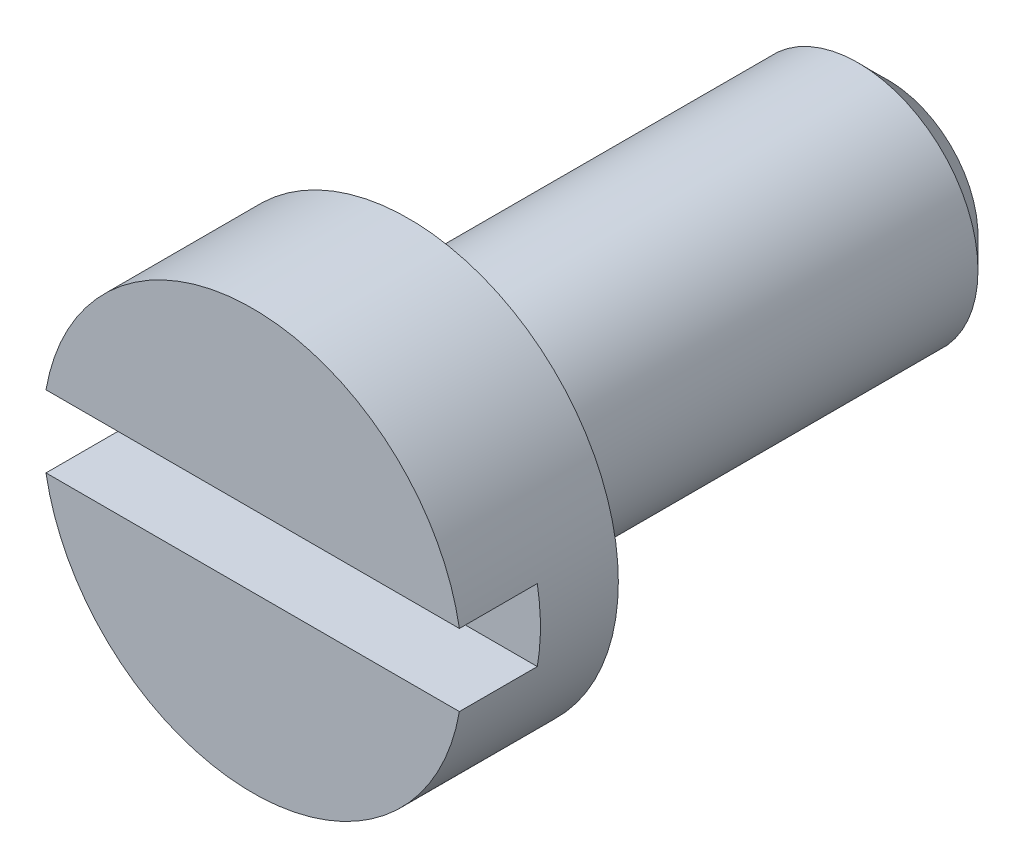
ISO-10303-21;
HEADER;
FILE_DESCRIPTION(('STEP AP214'),'2;1');
FILE_NAME('part.step','',(''),(''),'','','');
FILE_SCHEMA(('AUTOMOTIVE_DESIGN { 1 0 10303 214 1 1 1 1 }'));
ENDSEC;
DATA;
#1=APPLICATION_CONTEXT('core data for automotive mechanical design processes');
#2=APPLICATION_PROTOCOL_DEFINITION('international standard','automotive_design',2000,#1);
#3=PRODUCT_CONTEXT('',#1,'mechanical');
#4=PRODUCT('Part','Part','',(#3));
#5=PRODUCT_RELATED_PRODUCT_CATEGORY('part','',(#4));
#6=PRODUCT_DEFINITION_FORMATION('','',#4);
#7=PRODUCT_DEFINITION_CONTEXT('part definition',#1,'design');
#8=PRODUCT_DEFINITION('design','',#6,#7);
#9=PRODUCT_DEFINITION_SHAPE('','',#8);
#10=(LENGTH_UNIT() NAMED_UNIT(*) SI_UNIT(.MILLI.,.METRE.));
#11=(NAMED_UNIT(*) PLANE_ANGLE_UNIT() SI_UNIT($,.RADIAN.));
#12=(NAMED_UNIT(*) SI_UNIT($,.STERADIAN.) SOLID_ANGLE_UNIT());
#13=UNCERTAINTY_MEASURE_WITH_UNIT(LENGTH_MEASURE(1.E-05),#10,'distance_accuracy_value','');
#14=(GEOMETRIC_REPRESENTATION_CONTEXT(3) GLOBAL_UNCERTAINTY_ASSIGNED_CONTEXT((#13)) GLOBAL_UNIT_ASSIGNED_CONTEXT((#10,
#11,#12)) REPRESENTATION_CONTEXT('',''));
#15=CARTESIAN_POINT('',(0.,0.,0.));
#16=DIRECTION('',(0.,0.,1.));
#17=DIRECTION('',(1.,0.,0.));
#18=AXIS2_PLACEMENT_3D('',#15,#16,#17);
#19=CARTESIAN_POINT('',(0.,0.,2.6));
#20=DIRECTION('',(0.,0.,1.));
#21=DIRECTION('',(1.,0.,0.));
#22=AXIS2_PLACEMENT_3D('',#19,#20,#21);
#23=PLANE('',#22);
#24=DIRECTION('',(1.,0.,0.));
#25=VECTOR('',#24,1.);
#26=CARTESIAN_POINT('',(0.,-0.6,2.6));
#27=LINE('',#26,#25);
#28=CARTESIAN_POINT('',(-3.44818792991333,-0.6,2.6));
#29=VERTEX_POINT('',#28);
#30=CARTESIAN_POINT('',(3.44818792991333,-0.6,2.6));
#31=VERTEX_POINT('',#30);
#32=EDGE_CURVE('E59',#29,#31,#27,.T.);
#33=ORIENTED_EDGE('',*,*,#32,.F.);
#34=CARTESIAN_POINT('',(0.,0.,2.6));
#35=DIRECTION('',(0.,0.,1.));
#36=DIRECTION('',(1.,0.,0.));
#37=AXIS2_PLACEMENT_3D('',#34,#35,#36);
#38=CIRCLE('',#37,3.5);
#39=EDGE_CURVE('E94',#29,#31,#38,.T.);
#40=ORIENTED_EDGE('',*,*,#39,.T.);
#41=EDGE_LOOP('',(#33,#40));
#42=FACE_BOUND('',#41,.T.);
#43=ADVANCED_FACE('F36',(#42),#23,.T.);
#44=CARTESIAN_POINT('',(0.,0.,0.));
#45=DIRECTION('',(0.,0.,1.));
#46=DIRECTION('',(1.,0.,0.));
#47=AXIS2_PLACEMENT_3D('',#44,#45,#46);
#48=PLANE('',#47);
#49=CARTESIAN_POINT('',(0.,0.,0.));
#50=DIRECTION('',(0.,0.,1.));
#51=DIRECTION('',(1.,0.,0.));
#52=AXIS2_PLACEMENT_3D('',#49,#50,#51);
#53=CIRCLE('',#52,3.5);
#54=CARTESIAN_POINT('',(3.5,0.,0.));
#55=VERTEX_POINT('',#54);
#56=EDGE_CURVE('E100',#55,#55,#53,.T.);
#57=ORIENTED_EDGE('',*,*,#56,.F.);
#58=EDGE_LOOP('',(#57));
#59=FACE_BOUND('',#58,.T.);
#60=CARTESIAN_POINT('',(0.,0.,0.));
#61=DIRECTION('',(0.,0.,1.));
#62=DIRECTION('',(1.,0.,0.));
#63=AXIS2_PLACEMENT_3D('',#60,#61,#62);
#64=CIRCLE('',#63,2.);
#65=CARTESIAN_POINT('',(2.,0.,0.));
#66=VERTEX_POINT('',#65);
#67=EDGE_CURVE('E93',#66,#66,#64,.F.);
#68=ORIENTED_EDGE('',*,*,#67,.F.);
#69=EDGE_LOOP('',(#68));
#70=FACE_BOUND('',#69,.T.);
#71=ADVANCED_FACE('F124',(#59,#70),#48,.F.);
#72=CARTESIAN_POINT('',(0.,0.,2.6));
#73=DIRECTION('',(0.,0.,-1.));
#74=DIRECTION('',(-1.,0.,0.));
#75=AXIS2_PLACEMENT_3D('',#72,#73,#74);
#76=CYLINDRICAL_SURFACE('',#75,3.5);
#77=DIRECTION('',(0.,0.,-1.));
#78=VECTOR('',#77,1.);
#79=CARTESIAN_POINT('',(3.44818792991333,0.6,2.6));
#80=LINE('',#79,#78);
#81=CARTESIAN_POINT('',(3.44818792991333,0.6,2.6));
#82=VERTEX_POINT('',#81);
#83=CARTESIAN_POINT('',(3.44818792991333,0.6,1.3));
#84=VERTEX_POINT('',#83);
#85=EDGE_CURVE('E51',#82,#84,#80,.T.);
#86=ORIENTED_EDGE('',*,*,#85,.T.);
#87=CARTESIAN_POINT('',(0.,0.,1.3));
#88=DIRECTION('',(0.,0.,-1.));
#89=DIRECTION('',(-1.,0.,0.));
#90=AXIS2_PLACEMENT_3D('',#87,#88,#89);
#91=CIRCLE('',#90,3.5);
#92=CARTESIAN_POINT('',(3.44818792991333,-0.6,1.3));
#93=VERTEX_POINT('',#92);
#94=EDGE_CURVE('E40',#84,#93,#91,.T.);
#95=ORIENTED_EDGE('',*,*,#94,.T.);
#96=DIRECTION('',(0.,0.,-1.));
#97=VECTOR('',#96,1.);
#98=CARTESIAN_POINT('',(3.44818792991333,-0.6,2.6));
#99=LINE('',#98,#97);
#100=EDGE_CURVE('E112',#93,#31,#99,.F.);
#101=ORIENTED_EDGE('',*,*,#100,.T.);
#102=ORIENTED_EDGE('',*,*,#39,.F.);
#103=DIRECTION('',(0.,0.,-1.));
#104=VECTOR('',#103,1.);
#105=CARTESIAN_POINT('',(-3.44818792991333,-0.6,2.6));
#106=LINE('',#105,#104);
#107=CARTESIAN_POINT('',(-3.44818792991333,-0.6,1.3));
#108=VERTEX_POINT('',#107);
#109=EDGE_CURVE('E103',#29,#108,#106,.T.);
#110=ORIENTED_EDGE('',*,*,#109,.T.);
#111=CARTESIAN_POINT('',(-3.44818792991333,0.6,1.3));
#112=VERTEX_POINT('',#111);
#113=EDGE_CURVE('E11',#108,#112,#91,.T.);
#114=ORIENTED_EDGE('',*,*,#113,.T.);
#115=DIRECTION('',(0.,0.,-1.));
#116=VECTOR('',#115,1.);
#117=CARTESIAN_POINT('',(-3.44818792991333,0.6,2.6));
#118=LINE('',#117,#116);
#119=CARTESIAN_POINT('',(-3.44818792991333,0.6,2.6));
#120=VERTEX_POINT('',#119);
#121=EDGE_CURVE('E78',#112,#120,#118,.F.);
#122=ORIENTED_EDGE('',*,*,#121,.T.);
#123=EDGE_CURVE('E88',#82,#120,#38,.T.);
#124=ORIENTED_EDGE('',*,*,#123,.F.);
#125=EDGE_LOOP('',(#86,#95,#101,#102,#110,#114,#122,#124));
#126=FACE_BOUND('',#125,.T.);
#127=ORIENTED_EDGE('',*,*,#56,.T.);
#128=EDGE_LOOP('',(#127));
#129=FACE_BOUND('',#128,.T.);
#130=ADVANCED_FACE('F86',(#126,#129),#76,.T.);
#131=DIRECTION('',(-1.,0.,0.));
#132=VECTOR('',#131,1.);
#133=CARTESIAN_POINT('',(0.,0.6,2.6));
#134=LINE('',#133,#132);
#135=EDGE_CURVE('E75',#82,#120,#134,.T.);
#136=ORIENTED_EDGE('',*,*,#135,.F.);
#137=ORIENTED_EDGE('',*,*,#123,.T.);
#138=EDGE_LOOP('',(#136,#137));
#139=FACE_BOUND('',#138,.T.);
#140=ADVANCED_FACE('F92',(#139),#23,.T.);
#141=CARTESIAN_POINT('',(0.,0.,-8.));
#142=DIRECTION('',(0.,0.,1.));
#143=DIRECTION('',(1.,0.,0.));
#144=AXIS2_PLACEMENT_3D('',#141,#142,#143);
#145=CYLINDRICAL_SURFACE('',#144,2.);
#146=CARTESIAN_POINT('',(0.,0.,-7.5));
#147=DIRECTION('',(0.,0.,-1.));
#148=DIRECTION('',(-1.,0.,0.));
#149=AXIS2_PLACEMENT_3D('',#146,#147,#148);
#150=CIRCLE('',#149,2.);
#151=CARTESIAN_POINT('',(-2.,0.,-7.5));
#152=VERTEX_POINT('',#151);
#153=EDGE_CURVE('E83',#152,#152,#150,.F.);
#154=ORIENTED_EDGE('',*,*,#153,.T.);
#155=EDGE_LOOP('',(#154));
#156=FACE_BOUND('',#155,.T.);
#157=ORIENTED_EDGE('',*,*,#67,.T.);
#158=EDGE_LOOP('',(#157));
#159=FACE_BOUND('',#158,.T.);
#160=ADVANCED_FACE('F133',(#156,#159),#145,.T.);
#161=CARTESIAN_POINT('',(0.,0.,-8.));
#162=DIRECTION('',(0.,0.,-1.));
#163=DIRECTION('',(-1.,0.,0.));
#164=AXIS2_PLACEMENT_3D('',#161,#162,#163);
#165=PLANE('',#164);
#166=CARTESIAN_POINT('',(0.,0.,-8.));
#167=DIRECTION('',(0.,0.,-1.));
#168=DIRECTION('',(-1.,0.,0.));
#169=AXIS2_PLACEMENT_3D('',#166,#167,#168);
#170=CIRCLE('',#169,1.5);
#171=CARTESIAN_POINT('',(-1.5,0.,-8.));
#172=VERTEX_POINT('',#171);
#173=EDGE_CURVE('E97',#172,#172,#170,.T.);
#174=ORIENTED_EDGE('',*,*,#173,.T.);
#175=EDGE_LOOP('',(#174));
#176=FACE_BOUND('',#175,.T.);
#177=ADVANCED_FACE('F138',(#176),#165,.T.);
#178=CARTESIAN_POINT('',(0.,0.,-8.));
#179=DIRECTION('',(0.,0.,1.));
#180=DIRECTION('',(1.,0.,0.));
#181=AXIS2_PLACEMENT_3D('',#178,#179,#180);
#182=CONICAL_SURFACE('',#181,1.5,0.785398163397447);
#183=ORIENTED_EDGE('',*,*,#153,.F.);
#184=EDGE_LOOP('',(#183));
#185=FACE_BOUND('',#184,.T.);
#186=ORIENTED_EDGE('',*,*,#173,.F.);
#187=EDGE_LOOP('',(#186));
#188=FACE_BOUND('',#187,.T.);
#189=ADVANCED_FACE('F38',(#185,#188),#182,.T.);
#190=CARTESIAN_POINT('',(-3.5,-0.6,1.3));
#191=DIRECTION('',(0.,0.,-1.));
#192=DIRECTION('',(-1.,0.,0.));
#193=AXIS2_PLACEMENT_3D('',#190,#191,#192);
#194=PLANE('',#193);
#195=DIRECTION('',(1.,0.,0.));
#196=VECTOR('',#195,1.);
#197=CARTESIAN_POINT('',(-3.5,0.6,1.3));
#198=LINE('',#197,#196);
#199=EDGE_CURVE('E116',#112,#84,#198,.T.);
#200=ORIENTED_EDGE('',*,*,#199,.F.);
#201=ORIENTED_EDGE('',*,*,#113,.F.);
#202=DIRECTION('',(1.,0.,0.));
#203=VECTOR('',#202,1.);
#204=CARTESIAN_POINT('',(-3.5,-0.6,1.3));
#205=LINE('',#204,#203);
#206=EDGE_CURVE('E90',#108,#93,#205,.T.);
#207=ORIENTED_EDGE('',*,*,#206,.T.);
#208=ORIENTED_EDGE('',*,*,#94,.F.);
#209=EDGE_LOOP('',(#200,#201,#207,#208));
#210=FACE_BOUND('',#209,.T.);
#211=ADVANCED_FACE('F115',(#210),#194,.F.);
#212=CARTESIAN_POINT('',(-3.5,-0.6,1.3));
#213=DIRECTION('',(0.,-1.,0.));
#214=DIRECTION('',(0.,0.,-1.));
#215=AXIS2_PLACEMENT_3D('',#212,#213,#214);
#216=PLANE('',#215);
#217=ORIENTED_EDGE('',*,*,#32,.T.);
#218=ORIENTED_EDGE('',*,*,#100,.F.);
#219=ORIENTED_EDGE('',*,*,#206,.F.);
#220=ORIENTED_EDGE('',*,*,#109,.F.);
#221=EDGE_LOOP('',(#217,#218,#219,#220));
#222=FACE_BOUND('',#221,.T.);
#223=ADVANCED_FACE('F121',(#222),#216,.F.);
#224=CARTESIAN_POINT('',(-3.5,0.6,1.3));
#225=DIRECTION('',(0.,1.,0.));
#226=DIRECTION('',(0.,0.,1.));
#227=AXIS2_PLACEMENT_3D('',#224,#225,#226);
#228=PLANE('',#227);
#229=ORIENTED_EDGE('',*,*,#135,.T.);
#230=ORIENTED_EDGE('',*,*,#121,.F.);
#231=ORIENTED_EDGE('',*,*,#199,.T.);
#232=ORIENTED_EDGE('',*,*,#85,.F.);
#233=EDGE_LOOP('',(#229,#230,#231,#232));
#234=FACE_BOUND('',#233,.T.);
#235=ADVANCED_FACE('F77',(#234),#228,.F.);
#236=CLOSED_SHELL('',(#43,#71,#130,#140,#160,#177,#189,#211,#223,#235));
#237=MANIFOLD_SOLID_BREP('B2',#236);
#238=ADVANCED_BREP_SHAPE_REPRESENTATION('',(#18,#237),#14);
#239=SHAPE_DEFINITION_REPRESENTATION(#9,#238);
ENDSEC;
END-ISO-10303-21;
